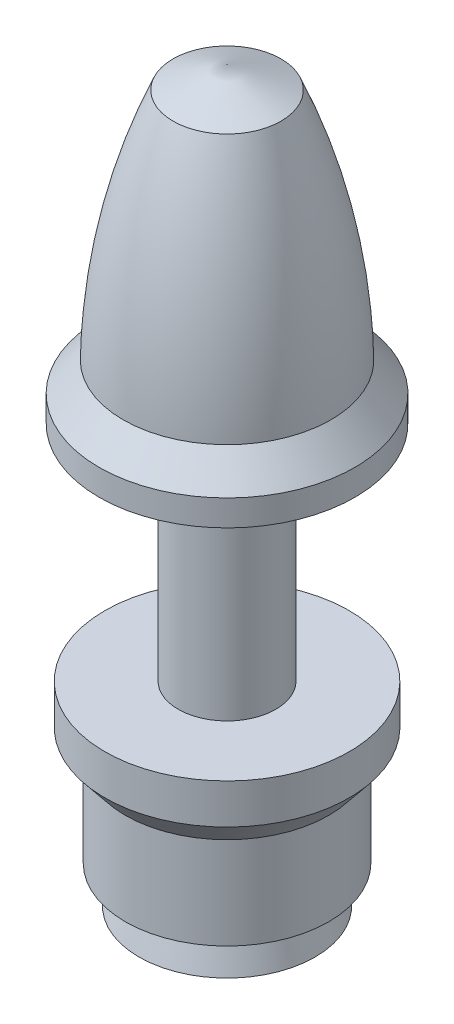
ISO-10303-21;
HEADER;
FILE_DESCRIPTION(('STEP AP214'),'2;1');
FILE_NAME('part.step','',(''),(''),'','','');
FILE_SCHEMA(('AUTOMOTIVE_DESIGN { 1 0 10303 214 1 1 1 1 }'));
ENDSEC;
DATA;
#1=APPLICATION_CONTEXT('core data for automotive mechanical design processes');
#2=APPLICATION_PROTOCOL_DEFINITION('international standard','automotive_design',2000,#1);
#3=PRODUCT_CONTEXT('',#1,'mechanical');
#4=PRODUCT('Part','Part','',(#3));
#5=PRODUCT_RELATED_PRODUCT_CATEGORY('part','',(#4));
#6=PRODUCT_DEFINITION_FORMATION('','',#4);
#7=PRODUCT_DEFINITION_CONTEXT('part definition',#1,'design');
#8=PRODUCT_DEFINITION('design','',#6,#7);
#9=PRODUCT_DEFINITION_SHAPE('','',#8);
#10=(LENGTH_UNIT() NAMED_UNIT(*) SI_UNIT(.MILLI.,.METRE.));
#11=(NAMED_UNIT(*) PLANE_ANGLE_UNIT() SI_UNIT($,.RADIAN.));
#12=(NAMED_UNIT(*) SI_UNIT($,.STERADIAN.) SOLID_ANGLE_UNIT());
#13=UNCERTAINTY_MEASURE_WITH_UNIT(LENGTH_MEASURE(1.E-05),#10,'distance_accuracy_value','');
#14=(GEOMETRIC_REPRESENTATION_CONTEXT(3) GLOBAL_UNCERTAINTY_ASSIGNED_CONTEXT((#13)) GLOBAL_UNIT_ASSIGNED_CONTEXT((#10,
#11,#12)) REPRESENTATION_CONTEXT('',''));
#15=CARTESIAN_POINT('',(0.,0.,0.));
#16=DIRECTION('',(0.,0.,1.));
#17=DIRECTION('',(1.,0.,0.));
#18=AXIS2_PLACEMENT_3D('',#15,#16,#17);
#19=CARTESIAN_POINT('',(0.,34.5948,0.));
#20=DIRECTION('',(0.,-1.,0.));
#21=DIRECTION('',(0.,0.,-1.));
#22=AXIS2_PLACEMENT_3D('',#19,#20,#21);
#23=CONICAL_SURFACE('',#22,2.6416,1.18285207031622);
#24=CARTESIAN_POINT('',(0.,35.6743,0.));
#25=VERTEX_POINT('',#24);
#26=VERTEX_LOOP('',#25);
#27=FACE_BOUND('',#26,.T.);
#28=CARTESIAN_POINT('',(0.,34.5948,0.));
#29=DIRECTION('',(0.,1.,0.));
#30=DIRECTION('',(0.,0.,1.));
#31=AXIS2_PLACEMENT_3D('',#28,#29,#30);
#32=CIRCLE('',#31,2.6416);
#33=CARTESIAN_POINT('',(0.,34.5948,2.6416));
#34=VERTEX_POINT('',#33);
#35=EDGE_CURVE('E12',#34,#34,#32,.T.);
#36=ORIENTED_EDGE('',*,*,#35,.T.);
#37=EDGE_LOOP('',(#36));
#38=FACE_BOUND('',#37,.T.);
#39=ADVANCED_FACE('F45',(#27,#38),#23,.T.);
#40=CARTESIAN_POINT('',(0.,22.5481312091711,0.));
#41=DIRECTION('',(0.,1.,0.));
#42=DIRECTION('',(0.,0.,1.));
#43=AXIS2_PLACEMENT_3D('',#40,#41,#42);
#44=DEGENERATE_TOROIDAL_SURFACE('',#43,25.8220762007129,30.9079778020976,.F.);
#45=ORIENTED_EDGE('',*,*,#35,.F.);
#46=EDGE_LOOP('',(#45));
#47=FACE_BOUND('',#46,.T.);
#48=CARTESIAN_POINT('',(0.,23.1521,0.));
#49=DIRECTION('',(0.,1.,0.));
#50=DIRECTION('',(0.,0.,1.));
#51=AXIS2_PLACEMENT_3D('',#48,#49,#50);
#52=CIRCLE('',#51,5.08);
#53=CARTESIAN_POINT('',(0.,23.1521,5.08));
#54=VERTEX_POINT('',#53);
#55=EDGE_CURVE('E51',#54,#54,#52,.T.);
#56=ORIENTED_EDGE('',*,*,#55,.T.);
#57=EDGE_LOOP('',(#56));
#58=FACE_BOUND('',#57,.T.);
#59=ADVANCED_FACE('F56',(#47,#58),#44,.F.);
#60=CARTESIAN_POINT('',(0.,21.7297,0.));
#61=DIRECTION('',(0.,-1.,0.));
#62=DIRECTION('',(0.,0.,-1.));
#63=AXIS2_PLACEMENT_3D('',#60,#61,#62);
#64=CONICAL_SURFACE('',#63,6.2611,0.692979263059281);
#65=ORIENTED_EDGE('',*,*,#55,.F.);
#66=EDGE_LOOP('',(#65));
#67=FACE_BOUND('',#66,.T.);
#68=CARTESIAN_POINT('',(0.,21.7297,0.));
#69=DIRECTION('',(0.,1.,0.));
#70=DIRECTION('',(0.,0.,1.));
#71=AXIS2_PLACEMENT_3D('',#68,#69,#70);
#72=CIRCLE('',#71,6.2611);
#73=CARTESIAN_POINT('',(0.,21.7297,6.2611));
#74=VERTEX_POINT('',#73);
#75=EDGE_CURVE('E65',#74,#74,#72,.T.);
#76=ORIENTED_EDGE('',*,*,#75,.T.);
#77=EDGE_LOOP('',(#76));
#78=FACE_BOUND('',#77,.T.);
#79=ADVANCED_FACE('F61',(#67,#78),#64,.T.);
#80=CARTESIAN_POINT('',(0.,35.6743,0.));
#81=DIRECTION('',(0.,1.,0.));
#82=DIRECTION('',(0.,0.,1.));
#83=AXIS2_PLACEMENT_3D('',#80,#81,#82);
#84=CYLINDRICAL_SURFACE('',#83,6.2611);
#85=ORIENTED_EDGE('',*,*,#75,.F.);
#86=EDGE_LOOP('',(#85));
#87=FACE_BOUND('',#86,.T.);
#88=CARTESIAN_POINT('',(0.,20.4597,0.));
#89=DIRECTION('',(0.,1.,0.));
#90=DIRECTION('',(0.,0.,1.));
#91=AXIS2_PLACEMENT_3D('',#88,#89,#90);
#92=CIRCLE('',#91,6.2611);
#93=CARTESIAN_POINT('',(0.,20.4597,6.2611));
#94=VERTEX_POINT('',#93);
#95=EDGE_CURVE('E67',#94,#94,#92,.T.);
#96=ORIENTED_EDGE('',*,*,#95,.T.);
#97=EDGE_LOOP('',(#96));
#98=FACE_BOUND('',#97,.T.);
#99=ADVANCED_FACE('F73',(#87,#98),#84,.T.);
#100=CARTESIAN_POINT('',(0.,20.4597,0.));
#101=DIRECTION('',(0.,1.,0.));
#102=DIRECTION('',(0.,0.,1.));
#103=AXIS2_PLACEMENT_3D('',#100,#101,#102);
#104=PLANE('',#103);
#105=ORIENTED_EDGE('',*,*,#95,.F.);
#106=EDGE_LOOP('',(#105));
#107=FACE_BOUND('',#106,.T.);
#108=ADVANCED_FACE('F75',(#107),#104,.F.);
#109=CLOSED_SHELL('',(#39,#59,#79,#99,#108));
#110=MANIFOLD_SOLID_BREP('B2',#109);
#111=CARTESIAN_POINT('',(0.,0.,0.));
#112=DIRECTION('',(0.,1.,0.));
#113=DIRECTION('',(-1.,0.,0.));
#114=AXIS2_PLACEMENT_3D('',#111,#112,#113);
#115=PLANE('',#114);
#116=CARTESIAN_POINT('',(0.,0.,0.));
#117=DIRECTION('',(0.,-1.,0.));
#118=DIRECTION('',(1.,0.,0.));
#119=AXIS2_PLACEMENT_3D('',#116,#117,#118);
#120=CIRCLE('',#119,1.5748);
#121=CARTESIAN_POINT('',(1.5748,0.,0.));
#122=VERTEX_POINT('',#121);
#123=EDGE_CURVE('E160',#122,#122,#120,.T.);
#124=ORIENTED_EDGE('',*,*,#123,.F.);
#125=EDGE_LOOP('',(#124));
#126=FACE_BOUND('',#125,.T.);
#127=CARTESIAN_POINT('',(0.,0.,0.));
#128=DIRECTION('',(0.,1.,0.));
#129=DIRECTION('',(-1.,0.,0.));
#130=AXIS2_PLACEMENT_3D('',#127,#128,#129);
#131=CIRCLE('',#130,4.31165);
#132=CARTESIAN_POINT('',(-4.31165,0.,0.));
#133=VERTEX_POINT('',#132);
#134=EDGE_CURVE('E44',#133,#133,#131,.T.);
#135=ORIENTED_EDGE('',*,*,#134,.F.);
#136=EDGE_LOOP('',(#135));
#137=FACE_BOUND('',#136,.T.);
#138=ADVANCED_FACE('F128',(#126,#137),#115,.F.);
#139=CARTESIAN_POINT('',(0.,0.,0.));
#140=DIRECTION('',(0.,-1.,0.));
#141=DIRECTION('',(1.,0.,0.));
#142=AXIS2_PLACEMENT_3D('',#139,#140,#141);
#143=CONICAL_SURFACE('',#142,4.31165,0.267720476876681);
#144=CARTESIAN_POINT('',(0.,1.8288,0.));
#145=DIRECTION('',(0.,1.,0.));
#146=DIRECTION('',(-1.,0.,0.));
#147=AXIS2_PLACEMENT_3D('',#144,#145,#146);
#148=CIRCLE('',#147,3.81);
#149=CARTESIAN_POINT('',(-3.81,1.8288,0.));
#150=VERTEX_POINT('',#149);
#151=EDGE_CURVE('E134',#150,#150,#148,.T.);
#152=ORIENTED_EDGE('',*,*,#151,.F.);
#153=EDGE_LOOP('',(#152));
#154=FACE_BOUND('',#153,.T.);
#155=ORIENTED_EDGE('',*,*,#134,.T.);
#156=EDGE_LOOP('',(#155));
#157=FACE_BOUND('',#156,.T.);
#158=ADVANCED_FACE('F177',(#154,#157),#143,.T.);
#159=CARTESIAN_POINT('',(4.9784,1.8288,0.));
#160=DIRECTION('',(0.,1.,0.));
#161=DIRECTION('',(-1.,0.,0.));
#162=AXIS2_PLACEMENT_3D('',#159,#160,#161);
#163=PLANE('',#162);
#164=CARTESIAN_POINT('',(0.,1.8288,0.));
#165=DIRECTION('',(0.,1.,0.));
#166=DIRECTION('',(-1.,0.,0.));
#167=AXIS2_PLACEMENT_3D('',#164,#165,#166);
#168=CIRCLE('',#167,4.9784);
#169=CARTESIAN_POINT('',(-4.9784,1.8288,0.));
#170=VERTEX_POINT('',#169);
#171=EDGE_CURVE('E138',#170,#170,#168,.T.);
#172=ORIENTED_EDGE('',*,*,#171,.F.);
#173=EDGE_LOOP('',(#172));
#174=FACE_BOUND('',#173,.T.);
#175=ORIENTED_EDGE('',*,*,#151,.T.);
#176=EDGE_LOOP('',(#175));
#177=FACE_BOUND('',#176,.T.);
#178=ADVANCED_FACE('F181',(#174,#177),#163,.F.);
#179=CARTESIAN_POINT('',(0.,24.2951,0.));
#180=DIRECTION('',(0.,1.,0.));
#181=DIRECTION('',(-1.,0.,0.));
#182=AXIS2_PLACEMENT_3D('',#179,#180,#181);
#183=CYLINDRICAL_SURFACE('',#182,4.9784);
#184=CARTESIAN_POINT('',(0.,6.3373,0.));
#185=DIRECTION('',(0.,1.,0.));
#186=DIRECTION('',(-1.,0.,0.));
#187=AXIS2_PLACEMENT_3D('',#184,#185,#186);
#188=CIRCLE('',#187,4.9784);
#189=CARTESIAN_POINT('',(-4.9784,6.3373,0.));
#190=VERTEX_POINT('',#189);
#191=EDGE_CURVE('E142',#190,#190,#188,.T.);
#192=ORIENTED_EDGE('',*,*,#191,.F.);
#193=EDGE_LOOP('',(#192));
#194=FACE_BOUND('',#193,.T.);
#195=ORIENTED_EDGE('',*,*,#171,.T.);
#196=EDGE_LOOP('',(#195));
#197=FACE_BOUND('',#196,.T.);
#198=ADVANCED_FACE('F186',(#194,#197),#183,.T.);
#199=CARTESIAN_POINT('',(0.,6.3373,0.));
#200=DIRECTION('',(0.,1.,0.));
#201=DIRECTION('',(-1.,0.,0.));
#202=AXIS2_PLACEMENT_3D('',#199,#200,#201);
#203=CONICAL_SURFACE('',#202,4.9784,0.678463009402464);
#204=CARTESIAN_POINT('',(0.,7.5819,0.));
#205=DIRECTION('',(0.,1.,0.));
#206=DIRECTION('',(-1.,0.,0.));
#207=AXIS2_PLACEMENT_3D('',#204,#205,#206);
#208=CIRCLE('',#207,5.9817);
#209=CARTESIAN_POINT('',(-5.9817,7.5819,0.));
#210=VERTEX_POINT('',#209);
#211=EDGE_CURVE('E147',#210,#210,#208,.T.);
#212=ORIENTED_EDGE('',*,*,#211,.F.);
#213=EDGE_LOOP('',(#212));
#214=FACE_BOUND('',#213,.T.);
#215=ORIENTED_EDGE('',*,*,#191,.T.);
#216=EDGE_LOOP('',(#215));
#217=FACE_BOUND('',#216,.T.);
#218=ADVANCED_FACE('F192',(#214,#217),#203,.T.);
#219=CARTESIAN_POINT('',(0.,24.2951,0.));
#220=DIRECTION('',(0.,1.,0.));
#221=DIRECTION('',(-1.,0.,0.));
#222=AXIS2_PLACEMENT_3D('',#219,#220,#221);
#223=CYLINDRICAL_SURFACE('',#222,5.9817);
#224=CARTESIAN_POINT('',(0.,9.5377,0.));
#225=DIRECTION('',(0.,1.,0.));
#226=DIRECTION('',(-1.,0.,0.));
#227=AXIS2_PLACEMENT_3D('',#224,#225,#226);
#228=CIRCLE('',#227,5.9817);
#229=CARTESIAN_POINT('',(-5.9817,9.5377,0.));
#230=VERTEX_POINT('',#229);
#231=EDGE_CURVE('E150',#230,#230,#228,.T.);
#232=ORIENTED_EDGE('',*,*,#231,.F.);
#233=EDGE_LOOP('',(#232));
#234=FACE_BOUND('',#233,.T.);
#235=ORIENTED_EDGE('',*,*,#211,.T.);
#236=EDGE_LOOP('',(#235));
#237=FACE_BOUND('',#236,.T.);
#238=ADVANCED_FACE('F196',(#234,#237),#223,.T.);
#239=CARTESIAN_POINT('',(5.9817,9.5377,0.));
#240=DIRECTION('',(0.,-1.,0.));
#241=DIRECTION('',(1.,0.,0.));
#242=AXIS2_PLACEMENT_3D('',#239,#240,#241);
#243=PLANE('',#242);
#244=CARTESIAN_POINT('',(0.,9.5377,0.));
#245=DIRECTION('',(0.,1.,0.));
#246=DIRECTION('',(-1.,0.,0.));
#247=AXIS2_PLACEMENT_3D('',#244,#245,#246);
#248=CIRCLE('',#247,2.3876);
#249=CARTESIAN_POINT('',(-2.3876,9.5377,0.));
#250=VERTEX_POINT('',#249);
#251=EDGE_CURVE('E153',#250,#250,#248,.T.);
#252=ORIENTED_EDGE('',*,*,#251,.F.);
#253=EDGE_LOOP('',(#252));
#254=FACE_BOUND('',#253,.T.);
#255=ORIENTED_EDGE('',*,*,#231,.T.);
#256=EDGE_LOOP('',(#255));
#257=FACE_BOUND('',#256,.T.);
#258=ADVANCED_FACE('F200',(#254,#257),#243,.F.);
#259=CARTESIAN_POINT('',(0.,24.2951,0.));
#260=DIRECTION('',(0.,1.,0.));
#261=DIRECTION('',(-1.,0.,0.));
#262=AXIS2_PLACEMENT_3D('',#259,#260,#261);
#263=CYLINDRICAL_SURFACE('',#262,2.3876);
#264=CARTESIAN_POINT('',(0.,24.2951,0.));
#265=DIRECTION('',(0.,1.,0.));
#266=DIRECTION('',(-1.,0.,0.));
#267=AXIS2_PLACEMENT_3D('',#264,#265,#266);
#268=CIRCLE('',#267,2.3876);
#269=CARTESIAN_POINT('',(-2.3876,24.2951,0.));
#270=VERTEX_POINT('',#269);
#271=EDGE_CURVE('E156',#270,#270,#268,.T.);
#272=ORIENTED_EDGE('',*,*,#271,.F.);
#273=EDGE_LOOP('',(#272));
#274=FACE_BOUND('',#273,.T.);
#275=ORIENTED_EDGE('',*,*,#251,.T.);
#276=EDGE_LOOP('',(#275));
#277=FACE_BOUND('',#276,.T.);
#278=ADVANCED_FACE('F204',(#274,#277),#263,.T.);
#279=CARTESIAN_POINT('',(2.3876,24.2951,0.));
#280=DIRECTION('',(0.,-1.,0.));
#281=DIRECTION('',(1.,0.,0.));
#282=AXIS2_PLACEMENT_3D('',#279,#280,#281);
#283=PLANE('',#282);
#284=ORIENTED_EDGE('',*,*,#271,.T.);
#285=EDGE_LOOP('',(#284));
#286=FACE_BOUND('',#285,.T.);
#287=ADVANCED_FACE('F171',(#286),#283,.F.);
#288=CARTESIAN_POINT('',(0.,2.54,0.));
#289=DIRECTION('',(0.,-1.,0.));
#290=DIRECTION('',(1.,0.,0.));
#291=AXIS2_PLACEMENT_3D('',#288,#289,#290);
#292=CYLINDRICAL_SURFACE('',#291,1.5748);
#293=CARTESIAN_POINT('',(0.,2.54,0.));
#294=DIRECTION('',(0.,-1.,0.));
#295=DIRECTION('',(1.,0.,0.));
#296=AXIS2_PLACEMENT_3D('',#293,#294,#295);
#297=CIRCLE('',#296,1.5748);
#298=CARTESIAN_POINT('',(1.5748,2.54,0.));
#299=VERTEX_POINT('',#298);
#300=EDGE_CURVE('E159',#299,#299,#297,.T.);
#301=ORIENTED_EDGE('',*,*,#300,.F.);
#302=EDGE_LOOP('',(#301));
#303=FACE_BOUND('',#302,.T.);
#304=ORIENTED_EDGE('',*,*,#123,.T.);
#305=EDGE_LOOP('',(#304));
#306=FACE_BOUND('',#305,.T.);
#307=ADVANCED_FACE('F168',(#303,#306),#292,.F.);
#308=CARTESIAN_POINT('',(0.,2.54,0.));
#309=DIRECTION('',(0.,-1.,0.));
#310=DIRECTION('',(1.,0.,0.));
#311=AXIS2_PLACEMENT_3D('',#308,#309,#310);
#312=PLANE('',#311);
#313=ORIENTED_EDGE('',*,*,#300,.T.);
#314=EDGE_LOOP('',(#313));
#315=FACE_BOUND('',#314,.T.);
#316=ADVANCED_FACE('F166',(#315),#312,.T.);
#317=CLOSED_SHELL('',(#138,#158,#178,#198,#218,#238,#258,#278,#287,#307,#316));
#318=MANIFOLD_SOLID_BREP('B6',#317);
#319=ADVANCED_BREP_SHAPE_REPRESENTATION('',(#18,#110,#318),#14);
#320=SHAPE_DEFINITION_REPRESENTATION(#9,#319);
ENDSEC;
END-ISO-10303-21;
